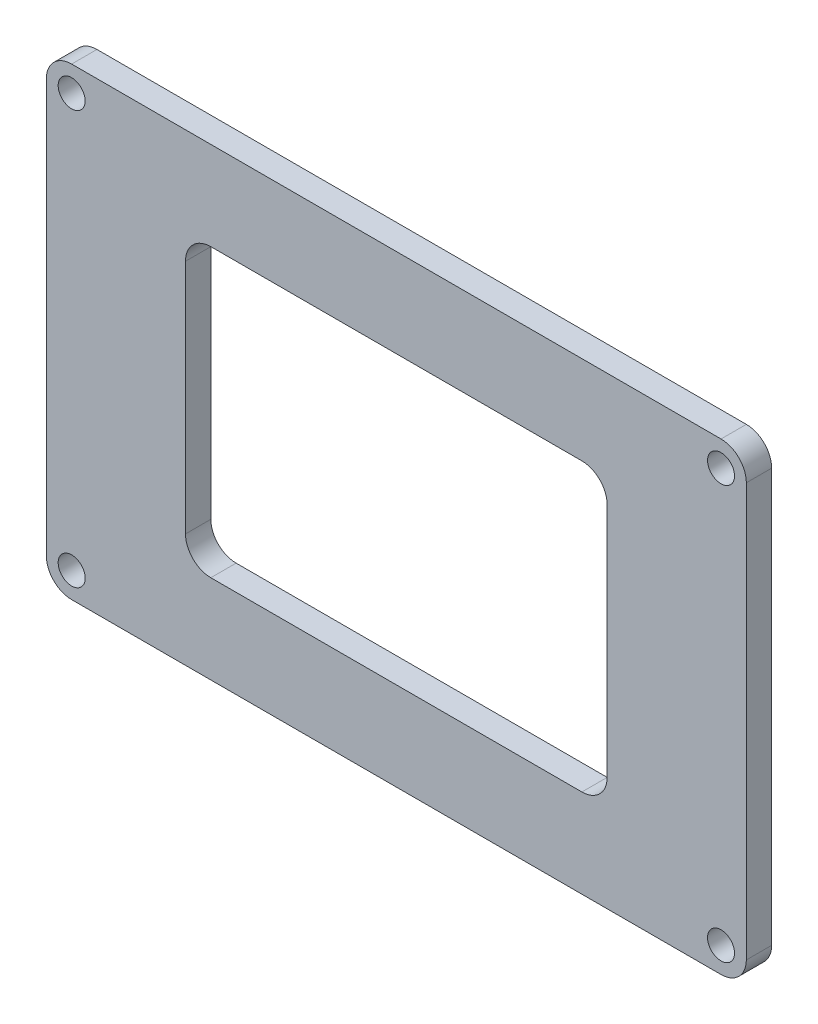
ISO-10303-21;
HEADER;
FILE_DESCRIPTION(('STEP AP214'),'2;1');
FILE_NAME('part.step','',(''),(''),'','','');
FILE_SCHEMA(('AUTOMOTIVE_DESIGN { 1 0 10303 214 1 1 1 1 }'));
ENDSEC;
DATA;
#1=APPLICATION_CONTEXT('core data for automotive mechanical design processes');
#2=APPLICATION_PROTOCOL_DEFINITION('international standard','automotive_design',2000,#1);
#3=PRODUCT_CONTEXT('',#1,'mechanical');
#4=PRODUCT('Part','Part','',(#3));
#5=PRODUCT_RELATED_PRODUCT_CATEGORY('part','',(#4));
#6=PRODUCT_DEFINITION_FORMATION('','',#4);
#7=PRODUCT_DEFINITION_CONTEXT('part definition',#1,'design');
#8=PRODUCT_DEFINITION('design','',#6,#7);
#9=PRODUCT_DEFINITION_SHAPE('','',#8);
#10=(LENGTH_UNIT() NAMED_UNIT(*) SI_UNIT(.MILLI.,.METRE.));
#11=(NAMED_UNIT(*) PLANE_ANGLE_UNIT() SI_UNIT($,.RADIAN.));
#12=(NAMED_UNIT(*) SI_UNIT($,.STERADIAN.) SOLID_ANGLE_UNIT());
#13=UNCERTAINTY_MEASURE_WITH_UNIT(LENGTH_MEASURE(1.E-05),#10,'distance_accuracy_value','');
#14=(GEOMETRIC_REPRESENTATION_CONTEXT(3) GLOBAL_UNCERTAINTY_ASSIGNED_CONTEXT((#13)) GLOBAL_UNIT_ASSIGNED_CONTEXT((#10,
#11,#12)) REPRESENTATION_CONTEXT('',''));
#15=CARTESIAN_POINT('',(0.,0.,0.));
#16=DIRECTION('',(0.,0.,1.));
#17=DIRECTION('',(1.,0.,0.));
#18=AXIS2_PLACEMENT_3D('',#15,#16,#17);
#19=CARTESIAN_POINT('',(0.,-49.,3.));
#20=DIRECTION('',(0.,0.,-1.));
#21=DIRECTION('',(-1.,0.,0.));
#22=AXIS2_PLACEMENT_3D('',#19,#20,#21);
#23=PLANE('',#22);
#24=CARTESIAN_POINT('',(77.,-49.,3.));
#25=DIRECTION('',(0.,0.,1.));
#26=DIRECTION('',(1.,0.,0.));
#27=AXIS2_PLACEMENT_3D('',#24,#25,#26);
#28=CIRCLE('',#27,1.60000000000001);
#29=CARTESIAN_POINT('',(78.6,-49.,3.));
#30=VERTEX_POINT('',#29);
#31=EDGE_CURVE('E221',#30,#30,#28,.T.);
#32=ORIENTED_EDGE('',*,*,#31,.F.);
#33=EDGE_LOOP('',(#32));
#34=FACE_BOUND('',#33,.T.);
#35=CARTESIAN_POINT('',(0.,-49.,3.));
#36=DIRECTION('',(0.,0.,1.));
#37=DIRECTION('',(1.,0.,0.));
#38=AXIS2_PLACEMENT_3D('',#35,#36,#37);
#39=CIRCLE('',#38,1.6);
#40=CARTESIAN_POINT('',(1.6,-49.,3.));
#41=VERTEX_POINT('',#40);
#42=EDGE_CURVE('E227',#41,#41,#39,.T.);
#43=ORIENTED_EDGE('',*,*,#42,.F.);
#44=EDGE_LOOP('',(#43));
#45=FACE_BOUND('',#44,.T.);
#46=CARTESIAN_POINT('',(77.,0.,3.));
#47=DIRECTION('',(0.,0.,1.));
#48=DIRECTION('',(1.,0.,0.));
#49=AXIS2_PLACEMENT_3D('',#46,#47,#48);
#50=CIRCLE('',#49,1.60000000000001);
#51=CARTESIAN_POINT('',(78.6,0.,3.));
#52=VERTEX_POINT('',#51);
#53=EDGE_CURVE('E233',#52,#52,#50,.T.);
#54=ORIENTED_EDGE('',*,*,#53,.F.);
#55=EDGE_LOOP('',(#54));
#56=FACE_BOUND('',#55,.T.);
#57=CARTESIAN_POINT('',(0.,0.,3.));
#58=DIRECTION('',(0.,0.,1.));
#59=DIRECTION('',(1.,0.,0.));
#60=AXIS2_PLACEMENT_3D('',#57,#58,#59);
#61=CIRCLE('',#60,1.6);
#62=CARTESIAN_POINT('',(1.6,0.,3.));
#63=VERTEX_POINT('',#62);
#64=EDGE_CURVE('E239',#63,#63,#61,.T.);
#65=ORIENTED_EDGE('',*,*,#64,.F.);
#66=EDGE_LOOP('',(#65));
#67=FACE_BOUND('',#66,.T.);
#68=CARTESIAN_POINT('',(0.,-49.,3.));
#69=DIRECTION('',(0.,0.,1.));
#70=DIRECTION('',(-1.,0.,0.));
#71=AXIS2_PLACEMENT_3D('',#68,#69,#70);
#72=CIRCLE('',#71,3.);
#73=CARTESIAN_POINT('',(-3.,-49.,3.));
#74=VERTEX_POINT('',#73);
#75=CARTESIAN_POINT('',(0.,-52.,3.));
#76=VERTEX_POINT('',#75);
#77=EDGE_CURVE('E245',#74,#76,#72,.T.);
#78=ORIENTED_EDGE('',*,*,#77,.T.);
#79=DIRECTION('',(1.,0.,0.));
#80=VECTOR('',#79,1.);
#81=CARTESIAN_POINT('',(0.,-52.,3.));
#82=LINE('',#81,#80);
#83=CARTESIAN_POINT('',(77.,-52.,3.));
#84=VERTEX_POINT('',#83);
#85=EDGE_CURVE('E248',#76,#84,#82,.T.);
#86=ORIENTED_EDGE('',*,*,#85,.T.);
#87=CARTESIAN_POINT('',(77.,-49.,3.));
#88=DIRECTION('',(0.,0.,1.));
#89=DIRECTION('',(1.,0.,0.));
#90=AXIS2_PLACEMENT_3D('',#87,#88,#89);
#91=CIRCLE('',#90,3.);
#92=CARTESIAN_POINT('',(80.,-49.,3.));
#93=VERTEX_POINT('',#92);
#94=EDGE_CURVE('E251',#84,#93,#91,.T.);
#95=ORIENTED_EDGE('',*,*,#94,.T.);
#96=DIRECTION('',(0.,1.,0.));
#97=VECTOR('',#96,1.);
#98=CARTESIAN_POINT('',(80.,-49.,3.));
#99=LINE('',#98,#97);
#100=CARTESIAN_POINT('',(80.,0.,3.));
#101=VERTEX_POINT('',#100);
#102=EDGE_CURVE('E253',#93,#101,#99,.T.);
#103=ORIENTED_EDGE('',*,*,#102,.T.);
#104=CARTESIAN_POINT('',(77.,0.,3.));
#105=DIRECTION('',(0.,0.,1.));
#106=DIRECTION('',(-1.,0.,0.));
#107=AXIS2_PLACEMENT_3D('',#104,#105,#106);
#108=CIRCLE('',#107,3.);
#109=CARTESIAN_POINT('',(77.,3.,3.));
#110=VERTEX_POINT('',#109);
#111=EDGE_CURVE('E255',#101,#110,#108,.T.);
#112=ORIENTED_EDGE('',*,*,#111,.T.);
#113=DIRECTION('',(-1.,0.,0.));
#114=VECTOR('',#113,1.);
#115=CARTESIAN_POINT('',(0.,3.,3.));
#116=LINE('',#115,#114);
#117=CARTESIAN_POINT('',(0.,3.,3.));
#118=VERTEX_POINT('',#117);
#119=EDGE_CURVE('E257',#110,#118,#116,.T.);
#120=ORIENTED_EDGE('',*,*,#119,.T.);
#121=CARTESIAN_POINT('',(0.,0.,3.));
#122=DIRECTION('',(0.,0.,1.));
#123=DIRECTION('',(-1.,0.,0.));
#124=AXIS2_PLACEMENT_3D('',#121,#122,#123);
#125=CIRCLE('',#124,3.);
#126=CARTESIAN_POINT('',(-3.,0.,3.));
#127=VERTEX_POINT('',#126);
#128=EDGE_CURVE('E259',#118,#127,#125,.T.);
#129=ORIENTED_EDGE('',*,*,#128,.T.);
#130=DIRECTION('',(0.,-1.,0.));
#131=VECTOR('',#130,1.);
#132=CARTESIAN_POINT('',(-3.,-49.,3.));
#133=LINE('',#132,#131);
#134=EDGE_CURVE('E261',#127,#74,#133,.T.);
#135=ORIENTED_EDGE('',*,*,#134,.T.);
#136=EDGE_LOOP('',(#78,#86,#95,#103,#112,#120,#129,#135));
#137=FACE_BOUND('',#136,.T.);
#138=CARTESIAN_POINT('',(16.5,-38.5,3.));
#139=DIRECTION('',(0.,0.,1.));
#140=DIRECTION('',(-1.,0.,0.));
#141=AXIS2_PLACEMENT_3D('',#138,#139,#140);
#142=CIRCLE('',#141,3.);
#143=CARTESIAN_POINT('',(13.5,-38.5,3.));
#144=VERTEX_POINT('',#143);
#145=CARTESIAN_POINT('',(16.5,-41.5,3.));
#146=VERTEX_POINT('',#145);
#147=EDGE_CURVE('E156',#144,#146,#142,.T.);
#148=ORIENTED_EDGE('',*,*,#147,.F.);
#149=DIRECTION('',(0.,-1.,0.));
#150=VECTOR('',#149,1.);
#151=CARTESIAN_POINT('',(13.5,-38.5,3.));
#152=LINE('',#151,#150);
#153=CARTESIAN_POINT('',(13.5,-10.5,3.));
#154=VERTEX_POINT('',#153);
#155=EDGE_CURVE('E189',#154,#144,#152,.T.);
#156=ORIENTED_EDGE('',*,*,#155,.F.);
#157=CARTESIAN_POINT('',(16.5,-10.5,3.));
#158=DIRECTION('',(0.,0.,1.));
#159=DIRECTION('',(-1.,0.,0.));
#160=AXIS2_PLACEMENT_3D('',#157,#158,#159);
#161=CIRCLE('',#160,3.);
#162=CARTESIAN_POINT('',(16.5,-7.49999999999999,3.));
#163=VERTEX_POINT('',#162);
#164=EDGE_CURVE('E187',#163,#154,#161,.T.);
#165=ORIENTED_EDGE('',*,*,#164,.F.);
#166=DIRECTION('',(-1.,0.,0.));
#167=VECTOR('',#166,1.);
#168=CARTESIAN_POINT('',(16.5,-7.49999999999999,3.));
#169=LINE('',#168,#167);
#170=CARTESIAN_POINT('',(60.5,-7.49999999999998,3.));
#171=VERTEX_POINT('',#170);
#172=EDGE_CURVE('E185',#171,#163,#169,.T.);
#173=ORIENTED_EDGE('',*,*,#172,.F.);
#174=CARTESIAN_POINT('',(60.5,-10.5,3.));
#175=DIRECTION('',(0.,0.,1.));
#176=DIRECTION('',(-1.,0.,0.));
#177=AXIS2_PLACEMENT_3D('',#174,#175,#176);
#178=CIRCLE('',#177,3.00000000000001);
#179=CARTESIAN_POINT('',(63.5,-10.5,3.));
#180=VERTEX_POINT('',#179);
#181=EDGE_CURVE('E183',#180,#171,#178,.T.);
#182=ORIENTED_EDGE('',*,*,#181,.F.);
#183=DIRECTION('',(0.,1.,0.));
#184=VECTOR('',#183,1.);
#185=CARTESIAN_POINT('',(63.5,-38.5,3.));
#186=LINE('',#185,#184);
#187=CARTESIAN_POINT('',(63.5,-38.5,3.));
#188=VERTEX_POINT('',#187);
#189=EDGE_CURVE('E179',#188,#180,#186,.T.);
#190=ORIENTED_EDGE('',*,*,#189,.F.);
#191=CARTESIAN_POINT('',(60.5,-38.5,3.));
#192=DIRECTION('',(0.,0.,1.));
#193=DIRECTION('',(1.,0.,0.));
#194=AXIS2_PLACEMENT_3D('',#191,#192,#193);
#195=CIRCLE('',#194,3.00000000000001);
#196=CARTESIAN_POINT('',(60.5,-41.5,3.));
#197=VERTEX_POINT('',#196);
#198=EDGE_CURVE('E177',#197,#188,#195,.T.);
#199=ORIENTED_EDGE('',*,*,#198,.F.);
#200=DIRECTION('',(1.,0.,0.));
#201=VECTOR('',#200,1.);
#202=CARTESIAN_POINT('',(16.5,-41.5,3.));
#203=LINE('',#202,#201);
#204=EDGE_CURVE('E164',#146,#197,#203,.T.);
#205=ORIENTED_EDGE('',*,*,#204,.F.);
#206=EDGE_LOOP('',(#148,#156,#165,#173,#182,#190,#199,#205));
#207=FACE_BOUND('',#206,.T.);
#208=ADVANCED_FACE('F43',(#34,#45,#56,#67,#137,#207),#23,.F.);
#209=CARTESIAN_POINT('',(0.,-49.,0.));
#210=DIRECTION('',(0.,0.,-1.));
#211=DIRECTION('',(-1.,0.,0.));
#212=AXIS2_PLACEMENT_3D('',#209,#210,#211);
#213=PLANE('',#212);
#214=CARTESIAN_POINT('',(0.,-49.,0.));
#215=DIRECTION('',(0.,0.,1.));
#216=DIRECTION('',(1.,0.,0.));
#217=AXIS2_PLACEMENT_3D('',#214,#215,#216);
#218=CIRCLE('',#217,1.6);
#219=CARTESIAN_POINT('',(1.6,-49.,0.));
#220=VERTEX_POINT('',#219);
#221=EDGE_CURVE('E224',#220,#220,#218,.T.);
#222=ORIENTED_EDGE('',*,*,#221,.T.);
#223=EDGE_LOOP('',(#222));
#224=FACE_BOUND('',#223,.T.);
#225=CARTESIAN_POINT('',(0.,0.,0.));
#226=DIRECTION('',(0.,0.,1.));
#227=DIRECTION('',(1.,0.,0.));
#228=AXIS2_PLACEMENT_3D('',#225,#226,#227);
#229=CIRCLE('',#228,1.6);
#230=CARTESIAN_POINT('',(1.6,0.,0.));
#231=VERTEX_POINT('',#230);
#232=EDGE_CURVE('E236',#231,#231,#229,.T.);
#233=ORIENTED_EDGE('',*,*,#232,.T.);
#234=EDGE_LOOP('',(#233));
#235=FACE_BOUND('',#234,.T.);
#236=CARTESIAN_POINT('',(0.,-49.,0.));
#237=DIRECTION('',(0.,0.,1.));
#238=DIRECTION('',(-1.,0.,0.));
#239=AXIS2_PLACEMENT_3D('',#236,#237,#238);
#240=CIRCLE('',#239,3.);
#241=CARTESIAN_POINT('',(-3.,-49.,0.));
#242=VERTEX_POINT('',#241);
#243=CARTESIAN_POINT('',(0.,-52.,0.));
#244=VERTEX_POINT('',#243);
#245=EDGE_CURVE('E242',#242,#244,#240,.T.);
#246=ORIENTED_EDGE('',*,*,#245,.F.);
#247=DIRECTION('',(0.,-1.,0.));
#248=VECTOR('',#247,1.);
#249=CARTESIAN_POINT('',(-3.,-49.,0.));
#250=LINE('',#249,#248);
#251=CARTESIAN_POINT('',(-3.,0.,0.));
#252=VERTEX_POINT('',#251);
#253=EDGE_CURVE('E249',#252,#242,#250,.T.);
#254=ORIENTED_EDGE('',*,*,#253,.F.);
#255=CARTESIAN_POINT('',(0.,0.,0.));
#256=DIRECTION('',(0.,0.,1.));
#257=DIRECTION('',(-1.,0.,0.));
#258=AXIS2_PLACEMENT_3D('',#255,#256,#257);
#259=CIRCLE('',#258,3.);
#260=CARTESIAN_POINT('',(0.,3.,0.));
#261=VERTEX_POINT('',#260);
#262=EDGE_CURVE('E276',#261,#252,#259,.T.);
#263=ORIENTED_EDGE('',*,*,#262,.F.);
#264=DIRECTION('',(-1.,0.,0.));
#265=VECTOR('',#264,1.);
#266=CARTESIAN_POINT('',(0.,3.,0.));
#267=LINE('',#266,#265);
#268=CARTESIAN_POINT('',(77.,3.,0.));
#269=VERTEX_POINT('',#268);
#270=EDGE_CURVE('E274',#269,#261,#267,.T.);
#271=ORIENTED_EDGE('',*,*,#270,.F.);
#272=CARTESIAN_POINT('',(77.,0.,0.));
#273=DIRECTION('',(0.,0.,1.));
#274=DIRECTION('',(-1.,0.,0.));
#275=AXIS2_PLACEMENT_3D('',#272,#273,#274);
#276=CIRCLE('',#275,3.);
#277=CARTESIAN_POINT('',(80.,0.,0.));
#278=VERTEX_POINT('',#277);
#279=EDGE_CURVE('E272',#278,#269,#276,.T.);
#280=ORIENTED_EDGE('',*,*,#279,.F.);
#281=DIRECTION('',(0.,1.,0.));
#282=VECTOR('',#281,1.);
#283=CARTESIAN_POINT('',(80.,-49.,0.));
#284=LINE('',#283,#282);
#285=CARTESIAN_POINT('',(80.,-49.,0.));
#286=VERTEX_POINT('',#285);
#287=EDGE_CURVE('E270',#286,#278,#284,.T.);
#288=ORIENTED_EDGE('',*,*,#287,.F.);
#289=CARTESIAN_POINT('',(77.,-49.,0.));
#290=DIRECTION('',(0.,0.,1.));
#291=DIRECTION('',(1.,0.,0.));
#292=AXIS2_PLACEMENT_3D('',#289,#290,#291);
#293=CIRCLE('',#292,3.);
#294=CARTESIAN_POINT('',(77.,-52.,0.));
#295=VERTEX_POINT('',#294);
#296=EDGE_CURVE('E268',#295,#286,#293,.T.);
#297=ORIENTED_EDGE('',*,*,#296,.F.);
#298=DIRECTION('',(1.,0.,0.));
#299=VECTOR('',#298,1.);
#300=CARTESIAN_POINT('',(0.,-52.,0.));
#301=LINE('',#300,#299);
#302=EDGE_CURVE('E266',#244,#295,#301,.T.);
#303=ORIENTED_EDGE('',*,*,#302,.F.);
#304=EDGE_LOOP('',(#246,#254,#263,#271,#280,#288,#297,#303));
#305=FACE_BOUND('',#304,.T.);
#306=CARTESIAN_POINT('',(77.,0.,0.));
#307=DIRECTION('',(0.,0.,1.));
#308=DIRECTION('',(1.,0.,0.));
#309=AXIS2_PLACEMENT_3D('',#306,#307,#308);
#310=CIRCLE('',#309,1.60000000000001);
#311=CARTESIAN_POINT('',(78.6,0.,0.));
#312=VERTEX_POINT('',#311);
#313=EDGE_CURVE('E230',#312,#312,#310,.T.);
#314=ORIENTED_EDGE('',*,*,#313,.T.);
#315=EDGE_LOOP('',(#314));
#316=FACE_BOUND('',#315,.T.);
#317=CARTESIAN_POINT('',(77.,-49.,0.));
#318=DIRECTION('',(0.,0.,1.));
#319=DIRECTION('',(1.,0.,0.));
#320=AXIS2_PLACEMENT_3D('',#317,#318,#319);
#321=CIRCLE('',#320,1.60000000000001);
#322=CARTESIAN_POINT('',(78.6,-49.,0.));
#323=VERTEX_POINT('',#322);
#324=EDGE_CURVE('E172',#323,#323,#321,.T.);
#325=ORIENTED_EDGE('',*,*,#324,.T.);
#326=EDGE_LOOP('',(#325));
#327=FACE_BOUND('',#326,.T.);
#328=DIRECTION('',(0.,-1.,0.));
#329=VECTOR('',#328,1.);
#330=CARTESIAN_POINT('',(13.5,-38.5,0.));
#331=LINE('',#330,#329);
#332=CARTESIAN_POINT('',(13.5,-10.5,0.));
#333=VERTEX_POINT('',#332);
#334=CARTESIAN_POINT('',(13.5,-38.5,0.));
#335=VERTEX_POINT('',#334);
#336=EDGE_CURVE('E165',#333,#335,#331,.T.);
#337=ORIENTED_EDGE('',*,*,#336,.T.);
#338=CARTESIAN_POINT('',(16.5,-38.5,0.));
#339=DIRECTION('',(0.,0.,1.));
#340=DIRECTION('',(-1.,0.,0.));
#341=AXIS2_PLACEMENT_3D('',#338,#339,#340);
#342=CIRCLE('',#341,3.);
#343=CARTESIAN_POINT('',(16.5,-41.5,0.));
#344=VERTEX_POINT('',#343);
#345=EDGE_CURVE('E66',#335,#344,#342,.T.);
#346=ORIENTED_EDGE('',*,*,#345,.T.);
#347=DIRECTION('',(1.,0.,0.));
#348=VECTOR('',#347,1.);
#349=CARTESIAN_POINT('',(16.5,-41.5,0.));
#350=LINE('',#349,#348);
#351=CARTESIAN_POINT('',(60.5,-41.5,0.));
#352=VERTEX_POINT('',#351);
#353=EDGE_CURVE('E171',#344,#352,#350,.T.);
#354=ORIENTED_EDGE('',*,*,#353,.T.);
#355=CARTESIAN_POINT('',(60.5,-38.5,0.));
#356=DIRECTION('',(0.,0.,1.));
#357=DIRECTION('',(1.,0.,0.));
#358=AXIS2_PLACEMENT_3D('',#355,#356,#357);
#359=CIRCLE('',#358,3.00000000000001);
#360=CARTESIAN_POINT('',(63.5,-38.5,0.));
#361=VERTEX_POINT('',#360);
#362=EDGE_CURVE('E193',#352,#361,#359,.T.);
#363=ORIENTED_EDGE('',*,*,#362,.T.);
#364=DIRECTION('',(0.,1.,0.));
#365=VECTOR('',#364,1.);
#366=CARTESIAN_POINT('',(63.5,-38.5,0.));
#367=LINE('',#366,#365);
#368=CARTESIAN_POINT('',(63.5,-10.5,0.));
#369=VERTEX_POINT('',#368);
#370=EDGE_CURVE('E196',#361,#369,#367,.T.);
#371=ORIENTED_EDGE('',*,*,#370,.T.);
#372=CARTESIAN_POINT('',(60.5,-10.5,0.));
#373=DIRECTION('',(0.,0.,1.));
#374=DIRECTION('',(-1.,0.,0.));
#375=AXIS2_PLACEMENT_3D('',#372,#373,#374);
#376=CIRCLE('',#375,3.00000000000001);
#377=CARTESIAN_POINT('',(60.5,-7.49999999999998,0.));
#378=VERTEX_POINT('',#377);
#379=EDGE_CURVE('E199',#369,#378,#376,.T.);
#380=ORIENTED_EDGE('',*,*,#379,.T.);
#381=DIRECTION('',(-1.,0.,0.));
#382=VECTOR('',#381,1.);
#383=CARTESIAN_POINT('',(16.5,-7.49999999999999,0.));
#384=LINE('',#383,#382);
#385=CARTESIAN_POINT('',(16.5,-7.49999999999999,0.));
#386=VERTEX_POINT('',#385);
#387=EDGE_CURVE('E202',#378,#386,#384,.T.);
#388=ORIENTED_EDGE('',*,*,#387,.T.);
#389=CARTESIAN_POINT('',(16.5,-10.5,0.));
#390=DIRECTION('',(0.,0.,1.));
#391=DIRECTION('',(-1.,0.,0.));
#392=AXIS2_PLACEMENT_3D('',#389,#390,#391);
#393=CIRCLE('',#392,3.);
#394=EDGE_CURVE('E205',#386,#333,#393,.T.);
#395=ORIENTED_EDGE('',*,*,#394,.T.);
#396=EDGE_LOOP('',(#337,#346,#354,#363,#371,#380,#388,#395));
#397=FACE_BOUND('',#396,.T.);
#398=ADVANCED_FACE('F306',(#224,#235,#305,#316,#327,#397),#213,.T.);
#399=CARTESIAN_POINT('',(0.,-49.,3.));
#400=DIRECTION('',(0.,0.,-1.));
#401=DIRECTION('',(-1.,0.,0.));
#402=AXIS2_PLACEMENT_3D('',#399,#400,#401);
#403=CYLINDRICAL_SURFACE('',#402,3.);
#404=ORIENTED_EDGE('',*,*,#245,.T.);
#405=DIRECTION('',(0.,0.,-1.));
#406=VECTOR('',#405,1.);
#407=CARTESIAN_POINT('',(0.,-52.,3.));
#408=LINE('',#407,#406);
#409=EDGE_CURVE('E11',#76,#244,#408,.T.);
#410=ORIENTED_EDGE('',*,*,#409,.F.);
#411=ORIENTED_EDGE('',*,*,#77,.F.);
#412=DIRECTION('',(0.,0.,-1.));
#413=VECTOR('',#412,1.);
#414=CARTESIAN_POINT('',(-3.,-49.,3.));
#415=LINE('',#414,#413);
#416=EDGE_CURVE('E263',#74,#242,#415,.T.);
#417=ORIENTED_EDGE('',*,*,#416,.T.);
#418=EDGE_LOOP('',(#404,#410,#411,#417));
#419=FACE_BOUND('',#418,.T.);
#420=ADVANCED_FACE('F45',(#419),#403,.T.);
#421=CARTESIAN_POINT('',(0.,-52.,3.));
#422=DIRECTION('',(0.,1.,0.));
#423=DIRECTION('',(0.,0.,1.));
#424=AXIS2_PLACEMENT_3D('',#421,#422,#423);
#425=PLANE('',#424);
#426=ORIENTED_EDGE('',*,*,#302,.T.);
#427=DIRECTION('',(0.,0.,-1.));
#428=VECTOR('',#427,1.);
#429=CARTESIAN_POINT('',(77.,-52.,3.));
#430=LINE('',#429,#428);
#431=EDGE_CURVE('E51',#84,#295,#430,.T.);
#432=ORIENTED_EDGE('',*,*,#431,.F.);
#433=ORIENTED_EDGE('',*,*,#85,.F.);
#434=ORIENTED_EDGE('',*,*,#409,.T.);
#435=EDGE_LOOP('',(#426,#432,#433,#434));
#436=FACE_BOUND('',#435,.T.);
#437=ADVANCED_FACE('F323',(#436),#425,.F.);
#438=CARTESIAN_POINT('',(77.,-49.,3.));
#439=DIRECTION('',(0.,0.,-1.));
#440=DIRECTION('',(-1.,0.,0.));
#441=AXIS2_PLACEMENT_3D('',#438,#439,#440);
#442=CYLINDRICAL_SURFACE('',#441,3.);
#443=ORIENTED_EDGE('',*,*,#296,.T.);
#444=DIRECTION('',(0.,0.,-1.));
#445=VECTOR('',#444,1.);
#446=CARTESIAN_POINT('',(80.,-49.,3.));
#447=LINE('',#446,#445);
#448=EDGE_CURVE('E293',#93,#286,#447,.T.);
#449=ORIENTED_EDGE('',*,*,#448,.F.);
#450=ORIENTED_EDGE('',*,*,#94,.F.);
#451=ORIENTED_EDGE('',*,*,#431,.T.);
#452=EDGE_LOOP('',(#443,#449,#450,#451));
#453=FACE_BOUND('',#452,.T.);
#454=ADVANCED_FACE('F300',(#453),#442,.T.);
#455=CARTESIAN_POINT('',(80.,-49.,3.));
#456=DIRECTION('',(-1.,0.,0.));
#457=DIRECTION('',(0.,0.,1.));
#458=AXIS2_PLACEMENT_3D('',#455,#456,#457);
#459=PLANE('',#458);
#460=ORIENTED_EDGE('',*,*,#287,.T.);
#461=DIRECTION('',(0.,0.,-1.));
#462=VECTOR('',#461,1.);
#463=CARTESIAN_POINT('',(80.,0.,3.));
#464=LINE('',#463,#462);
#465=EDGE_CURVE('E290',#101,#278,#464,.T.);
#466=ORIENTED_EDGE('',*,*,#465,.F.);
#467=ORIENTED_EDGE('',*,*,#102,.F.);
#468=ORIENTED_EDGE('',*,*,#448,.T.);
#469=EDGE_LOOP('',(#460,#466,#467,#468));
#470=FACE_BOUND('',#469,.T.);
#471=ADVANCED_FACE('F312',(#470),#459,.F.);
#472=CARTESIAN_POINT('',(77.,0.,3.));
#473=DIRECTION('',(0.,0.,-1.));
#474=DIRECTION('',(-1.,0.,0.));
#475=AXIS2_PLACEMENT_3D('',#472,#473,#474);
#476=CYLINDRICAL_SURFACE('',#475,3.);
#477=ORIENTED_EDGE('',*,*,#279,.T.);
#478=DIRECTION('',(0.,0.,-1.));
#479=VECTOR('',#478,1.);
#480=CARTESIAN_POINT('',(77.,3.,3.));
#481=LINE('',#480,#479);
#482=EDGE_CURVE('E287',#110,#269,#481,.T.);
#483=ORIENTED_EDGE('',*,*,#482,.F.);
#484=ORIENTED_EDGE('',*,*,#111,.F.);
#485=ORIENTED_EDGE('',*,*,#465,.T.);
#486=EDGE_LOOP('',(#477,#483,#484,#485));
#487=FACE_BOUND('',#486,.T.);
#488=ADVANCED_FACE('F316',(#487),#476,.T.);
#489=CARTESIAN_POINT('',(0.,3.,3.));
#490=DIRECTION('',(0.,-1.,0.));
#491=DIRECTION('',(1.,0.,0.));
#492=AXIS2_PLACEMENT_3D('',#489,#490,#491);
#493=PLANE('',#492);
#494=ORIENTED_EDGE('',*,*,#270,.T.);
#495=DIRECTION('',(0.,0.,-1.));
#496=VECTOR('',#495,1.);
#497=CARTESIAN_POINT('',(0.,3.,3.));
#498=LINE('',#497,#496);
#499=EDGE_CURVE('E284',#118,#261,#498,.T.);
#500=ORIENTED_EDGE('',*,*,#499,.F.);
#501=ORIENTED_EDGE('',*,*,#119,.F.);
#502=ORIENTED_EDGE('',*,*,#482,.T.);
#503=EDGE_LOOP('',(#494,#500,#501,#502));
#504=FACE_BOUND('',#503,.T.);
#505=ADVANCED_FACE('F336',(#504),#493,.F.);
#506=CARTESIAN_POINT('',(0.,0.,3.));
#507=DIRECTION('',(0.,0.,-1.));
#508=DIRECTION('',(-1.,0.,0.));
#509=AXIS2_PLACEMENT_3D('',#506,#507,#508);
#510=CYLINDRICAL_SURFACE('',#509,3.);
#511=ORIENTED_EDGE('',*,*,#262,.T.);
#512=DIRECTION('',(0.,0.,-1.));
#513=VECTOR('',#512,1.);
#514=CARTESIAN_POINT('',(-3.,0.,3.));
#515=LINE('',#514,#513);
#516=EDGE_CURVE('E281',#127,#252,#515,.T.);
#517=ORIENTED_EDGE('',*,*,#516,.F.);
#518=ORIENTED_EDGE('',*,*,#128,.F.);
#519=ORIENTED_EDGE('',*,*,#499,.T.);
#520=EDGE_LOOP('',(#511,#517,#518,#519));
#521=FACE_BOUND('',#520,.T.);
#522=ADVANCED_FACE('F334',(#521),#510,.T.);
#523=CARTESIAN_POINT('',(-3.,-49.,3.));
#524=DIRECTION('',(1.,0.,0.));
#525=DIRECTION('',(0.,0.,-1.));
#526=AXIS2_PLACEMENT_3D('',#523,#524,#525);
#527=PLANE('',#526);
#528=ORIENTED_EDGE('',*,*,#253,.T.);
#529=ORIENTED_EDGE('',*,*,#416,.F.);
#530=ORIENTED_EDGE('',*,*,#134,.F.);
#531=ORIENTED_EDGE('',*,*,#516,.T.);
#532=EDGE_LOOP('',(#528,#529,#530,#531));
#533=FACE_BOUND('',#532,.T.);
#534=ADVANCED_FACE('F329',(#533),#527,.F.);
#535=CARTESIAN_POINT('',(0.,0.,3.));
#536=DIRECTION('',(0.,0.,-1.));
#537=DIRECTION('',(-1.,0.,0.));
#538=AXIS2_PLACEMENT_3D('',#535,#536,#537);
#539=CYLINDRICAL_SURFACE('',#538,1.6);
#540=ORIENTED_EDGE('',*,*,#64,.T.);
#541=EDGE_LOOP('',(#540));
#542=FACE_BOUND('',#541,.T.);
#543=ORIENTED_EDGE('',*,*,#232,.F.);
#544=EDGE_LOOP('',(#543));
#545=FACE_BOUND('',#544,.T.);
#546=ADVANCED_FACE('F356',(#542,#545),#539,.F.);
#547=CARTESIAN_POINT('',(77.,0.,3.));
#548=DIRECTION('',(0.,0.,-1.));
#549=DIRECTION('',(-1.,0.,0.));
#550=AXIS2_PLACEMENT_3D('',#547,#548,#549);
#551=CYLINDRICAL_SURFACE('',#550,1.60000000000001);
#552=ORIENTED_EDGE('',*,*,#53,.T.);
#553=EDGE_LOOP('',(#552));
#554=FACE_BOUND('',#553,.T.);
#555=ORIENTED_EDGE('',*,*,#313,.F.);
#556=EDGE_LOOP('',(#555));
#557=FACE_BOUND('',#556,.T.);
#558=ADVANCED_FACE('F363',(#554,#557),#551,.F.);
#559=CARTESIAN_POINT('',(0.,-49.,3.));
#560=DIRECTION('',(0.,0.,-1.));
#561=DIRECTION('',(-1.,0.,0.));
#562=AXIS2_PLACEMENT_3D('',#559,#560,#561);
#563=CYLINDRICAL_SURFACE('',#562,1.6);
#564=ORIENTED_EDGE('',*,*,#42,.T.);
#565=EDGE_LOOP('',(#564));
#566=FACE_BOUND('',#565,.T.);
#567=ORIENTED_EDGE('',*,*,#221,.F.);
#568=EDGE_LOOP('',(#567));
#569=FACE_BOUND('',#568,.T.);
#570=ADVANCED_FACE('F368',(#566,#569),#563,.F.);
#571=CARTESIAN_POINT('',(77.,-49.,3.));
#572=DIRECTION('',(0.,0.,-1.));
#573=DIRECTION('',(-1.,0.,0.));
#574=AXIS2_PLACEMENT_3D('',#571,#572,#573);
#575=CYLINDRICAL_SURFACE('',#574,1.60000000000001);
#576=ORIENTED_EDGE('',*,*,#31,.T.);
#577=EDGE_LOOP('',(#576));
#578=FACE_BOUND('',#577,.T.);
#579=ORIENTED_EDGE('',*,*,#324,.F.);
#580=EDGE_LOOP('',(#579));
#581=FACE_BOUND('',#580,.T.);
#582=ADVANCED_FACE('F378',(#578,#581),#575,.F.);
#583=CARTESIAN_POINT('',(16.5,-38.5,3.));
#584=DIRECTION('',(0.,0.,-1.));
#585=DIRECTION('',(-1.,0.,0.));
#586=AXIS2_PLACEMENT_3D('',#583,#584,#585);
#587=CYLINDRICAL_SURFACE('',#586,3.);
#588=ORIENTED_EDGE('',*,*,#345,.F.);
#589=DIRECTION('',(0.,0.,-1.));
#590=VECTOR('',#589,1.);
#591=CARTESIAN_POINT('',(13.5,-38.5,3.));
#592=LINE('',#591,#590);
#593=EDGE_CURVE('E160',#144,#335,#592,.T.);
#594=ORIENTED_EDGE('',*,*,#593,.F.);
#595=ORIENTED_EDGE('',*,*,#147,.T.);
#596=DIRECTION('',(0.,0.,-1.));
#597=VECTOR('',#596,1.);
#598=CARTESIAN_POINT('',(16.5,-41.5,3.));
#599=LINE('',#598,#597);
#600=EDGE_CURVE('E159',#146,#344,#599,.T.);
#601=ORIENTED_EDGE('',*,*,#600,.T.);
#602=EDGE_LOOP('',(#588,#594,#595,#601));
#603=FACE_BOUND('',#602,.T.);
#604=ADVANCED_FACE('F158',(#603),#587,.F.);
#605=CARTESIAN_POINT('',(16.5,-41.5,3.));
#606=DIRECTION('',(0.,1.,0.));
#607=DIRECTION('',(0.,0.,1.));
#608=AXIS2_PLACEMENT_3D('',#605,#606,#607);
#609=PLANE('',#608);
#610=ORIENTED_EDGE('',*,*,#353,.F.);
#611=ORIENTED_EDGE('',*,*,#600,.F.);
#612=ORIENTED_EDGE('',*,*,#204,.T.);
#613=DIRECTION('',(0.,0.,-1.));
#614=VECTOR('',#613,1.);
#615=CARTESIAN_POINT('',(60.5,-41.5,3.));
#616=LINE('',#615,#614);
#617=EDGE_CURVE('E173',#197,#352,#616,.T.);
#618=ORIENTED_EDGE('',*,*,#617,.T.);
#619=EDGE_LOOP('',(#610,#611,#612,#618));
#620=FACE_BOUND('',#619,.T.);
#621=ADVANCED_FACE('F168',(#620),#609,.T.);
#622=CARTESIAN_POINT('',(60.5,-38.5,3.));
#623=DIRECTION('',(0.,0.,-1.));
#624=DIRECTION('',(-1.,0.,0.));
#625=AXIS2_PLACEMENT_3D('',#622,#623,#624);
#626=CYLINDRICAL_SURFACE('',#625,3.00000000000001);
#627=ORIENTED_EDGE('',*,*,#362,.F.);
#628=ORIENTED_EDGE('',*,*,#617,.F.);
#629=ORIENTED_EDGE('',*,*,#198,.T.);
#630=DIRECTION('',(0.,0.,-1.));
#631=VECTOR('',#630,1.);
#632=CARTESIAN_POINT('',(63.5,-38.5,3.));
#633=LINE('',#632,#631);
#634=EDGE_CURVE('E218',#188,#361,#633,.T.);
#635=ORIENTED_EDGE('',*,*,#634,.T.);
#636=EDGE_LOOP('',(#627,#628,#629,#635));
#637=FACE_BOUND('',#636,.T.);
#638=ADVANCED_FACE('F390',(#637),#626,.F.);
#639=CARTESIAN_POINT('',(63.5,-38.5,3.));
#640=DIRECTION('',(-1.,0.,0.));
#641=DIRECTION('',(0.,0.,1.));
#642=AXIS2_PLACEMENT_3D('',#639,#640,#641);
#643=PLANE('',#642);
#644=ORIENTED_EDGE('',*,*,#370,.F.);
#645=ORIENTED_EDGE('',*,*,#634,.F.);
#646=ORIENTED_EDGE('',*,*,#189,.T.);
#647=DIRECTION('',(0.,0.,-1.));
#648=VECTOR('',#647,1.);
#649=CARTESIAN_POINT('',(63.5,-10.5,3.));
#650=LINE('',#649,#648);
#651=EDGE_CURVE('E216',#180,#369,#650,.T.);
#652=ORIENTED_EDGE('',*,*,#651,.T.);
#653=EDGE_LOOP('',(#644,#645,#646,#652));
#654=FACE_BOUND('',#653,.T.);
#655=ADVANCED_FACE('F393',(#654),#643,.T.);
#656=CARTESIAN_POINT('',(60.5,-10.5,3.));
#657=DIRECTION('',(0.,0.,-1.));
#658=DIRECTION('',(-1.,0.,0.));
#659=AXIS2_PLACEMENT_3D('',#656,#657,#658);
#660=CYLINDRICAL_SURFACE('',#659,3.00000000000001);
#661=ORIENTED_EDGE('',*,*,#379,.F.);
#662=ORIENTED_EDGE('',*,*,#651,.F.);
#663=ORIENTED_EDGE('',*,*,#181,.T.);
#664=DIRECTION('',(0.,0.,-1.));
#665=VECTOR('',#664,1.);
#666=CARTESIAN_POINT('',(60.5,-7.49999999999998,3.));
#667=LINE('',#666,#665);
#668=EDGE_CURVE('E214',#171,#378,#667,.T.);
#669=ORIENTED_EDGE('',*,*,#668,.T.);
#670=EDGE_LOOP('',(#661,#662,#663,#669));
#671=FACE_BOUND('',#670,.T.);
#672=ADVANCED_FACE('F397',(#671),#660,.F.);
#673=CARTESIAN_POINT('',(16.5,-7.49999999999999,3.));
#674=DIRECTION('',(0.,-1.,0.));
#675=DIRECTION('',(0.,0.,-1.));
#676=AXIS2_PLACEMENT_3D('',#673,#674,#675);
#677=PLANE('',#676);
#678=ORIENTED_EDGE('',*,*,#387,.F.);
#679=ORIENTED_EDGE('',*,*,#668,.F.);
#680=ORIENTED_EDGE('',*,*,#172,.T.);
#681=DIRECTION('',(0.,0.,-1.));
#682=VECTOR('',#681,1.);
#683=CARTESIAN_POINT('',(16.5,-7.49999999999999,3.));
#684=LINE('',#683,#682);
#685=EDGE_CURVE('E212',#163,#386,#684,.T.);
#686=ORIENTED_EDGE('',*,*,#685,.T.);
#687=EDGE_LOOP('',(#678,#679,#680,#686));
#688=FACE_BOUND('',#687,.T.);
#689=ADVANCED_FACE('F401',(#688),#677,.T.);
#690=CARTESIAN_POINT('',(16.5,-10.5,3.));
#691=DIRECTION('',(0.,0.,-1.));
#692=DIRECTION('',(-1.,0.,0.));
#693=AXIS2_PLACEMENT_3D('',#690,#691,#692);
#694=CYLINDRICAL_SURFACE('',#693,3.);
#695=ORIENTED_EDGE('',*,*,#394,.F.);
#696=ORIENTED_EDGE('',*,*,#685,.F.);
#697=ORIENTED_EDGE('',*,*,#164,.T.);
#698=DIRECTION('',(0.,0.,-1.));
#699=VECTOR('',#698,1.);
#700=CARTESIAN_POINT('',(13.5,-10.5,3.));
#701=LINE('',#700,#699);
#702=EDGE_CURVE('E58',#154,#333,#701,.T.);
#703=ORIENTED_EDGE('',*,*,#702,.T.);
#704=EDGE_LOOP('',(#695,#696,#697,#703));
#705=FACE_BOUND('',#704,.T.);
#706=ADVANCED_FACE('F405',(#705),#694,.F.);
#707=CARTESIAN_POINT('',(13.5,-38.5,3.));
#708=DIRECTION('',(1.,0.,0.));
#709=DIRECTION('',(0.,0.,-1.));
#710=AXIS2_PLACEMENT_3D('',#707,#708,#709);
#711=PLANE('',#710);
#712=ORIENTED_EDGE('',*,*,#336,.F.);
#713=ORIENTED_EDGE('',*,*,#702,.F.);
#714=ORIENTED_EDGE('',*,*,#155,.T.);
#715=ORIENTED_EDGE('',*,*,#593,.T.);
#716=EDGE_LOOP('',(#712,#713,#714,#715));
#717=FACE_BOUND('',#716,.T.);
#718=ADVANCED_FACE('F409',(#717),#711,.T.);
#719=CLOSED_SHELL('',(#208,#398,#420,#437,#454,#471,#488,#505,#522,#534,#546,#558,#570,#582,
#604,#621,#638,#655,#672,#689,#706,#718));
#720=MANIFOLD_SOLID_BREP('B2',#719);
#721=ADVANCED_BREP_SHAPE_REPRESENTATION('',(#18,#720),#14);
#722=SHAPE_DEFINITION_REPRESENTATION(#9,#721);
ENDSEC;
END-ISO-10303-21;
